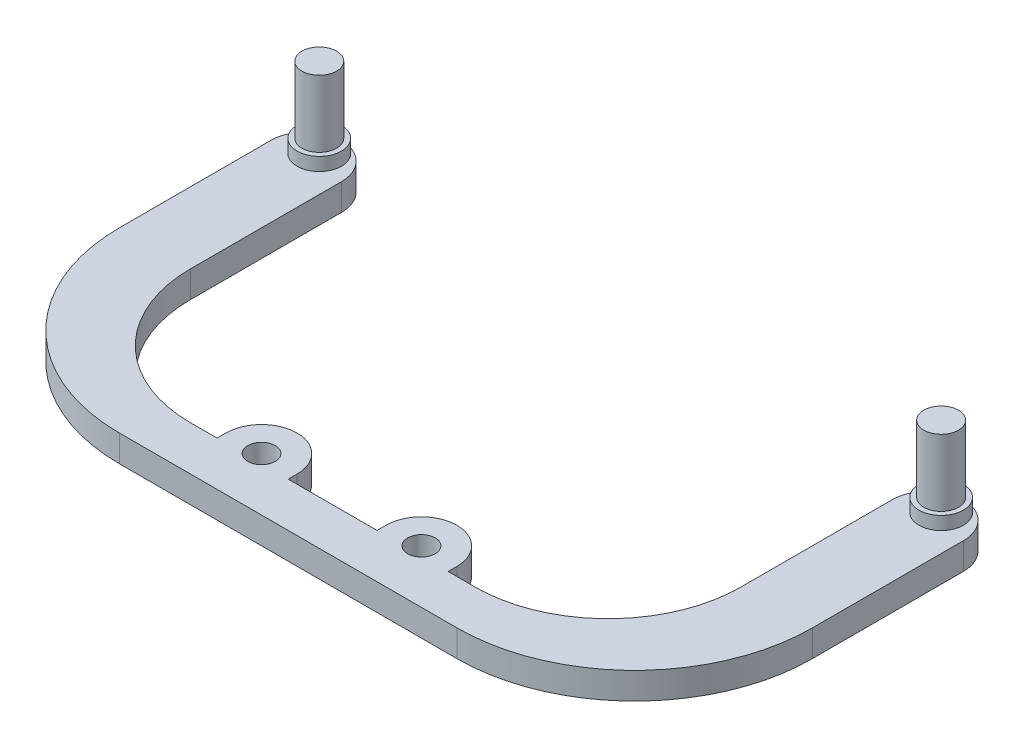
ISO-10303-21;
HEADER;
FILE_DESCRIPTION(('STEP AP214'),'2;1');
FILE_NAME('part.step','',(''),(''),'','','');
FILE_SCHEMA(('AUTOMOTIVE_DESIGN { 1 0 10303 214 1 1 1 1 }'));
ENDSEC;
DATA;
#1=APPLICATION_CONTEXT('core data for automotive mechanical design processes');
#2=APPLICATION_PROTOCOL_DEFINITION('international standard','automotive_design',2000,#1);
#3=PRODUCT_CONTEXT('',#1,'mechanical');
#4=PRODUCT('Part','Part','',(#3));
#5=PRODUCT_RELATED_PRODUCT_CATEGORY('part','',(#4));
#6=PRODUCT_DEFINITION_FORMATION('','',#4);
#7=PRODUCT_DEFINITION_CONTEXT('part definition',#1,'design');
#8=PRODUCT_DEFINITION('design','',#6,#7);
#9=PRODUCT_DEFINITION_SHAPE('','',#8);
#10=(LENGTH_UNIT() NAMED_UNIT(*) SI_UNIT(.MILLI.,.METRE.));
#11=(NAMED_UNIT(*) PLANE_ANGLE_UNIT() SI_UNIT($,.RADIAN.));
#12=(NAMED_UNIT(*) SI_UNIT($,.STERADIAN.) SOLID_ANGLE_UNIT());
#13=UNCERTAINTY_MEASURE_WITH_UNIT(LENGTH_MEASURE(1.E-05),#10,'distance_accuracy_value','');
#14=(GEOMETRIC_REPRESENTATION_CONTEXT(3) GLOBAL_UNCERTAINTY_ASSIGNED_CONTEXT((#13)) GLOBAL_UNIT_ASSIGNED_CONTEXT((#10,
#11,#12)) REPRESENTATION_CONTEXT('',''));
#15=CARTESIAN_POINT('',(0.,0.,0.));
#16=DIRECTION('',(0.,0.,1.));
#17=DIRECTION('',(1.,0.,0.));
#18=AXIS2_PLACEMENT_3D('',#15,#16,#17);
#19=CARTESIAN_POINT('',(0.,3.,0.));
#20=DIRECTION('',(0.,-1.,0.));
#21=DIRECTION('',(0.,0.,-1.));
#22=AXIS2_PLACEMENT_3D('',#19,#20,#21);
#23=PLANE('',#22);
#24=CARTESIAN_POINT('',(-9.,3.,-1.));
#25=DIRECTION('',(0.,1.,0.));
#26=DIRECTION('',(0.,0.,1.));
#27=AXIS2_PLACEMENT_3D('',#24,#25,#26);
#28=CIRCLE('',#27,1.55);
#29=CARTESIAN_POINT('',(-9.,3.,0.549999999999997));
#30=VERTEX_POINT('',#29);
#31=EDGE_CURVE('E228',#30,#30,#28,.T.);
#32=ORIENTED_EDGE('',*,*,#31,.F.);
#33=EDGE_LOOP('',(#32));
#34=FACE_BOUND('',#33,.T.);
#35=CARTESIAN_POINT('',(9.,3.,-1.));
#36=DIRECTION('',(0.,-1.,0.));
#37=DIRECTION('',(0.,0.,1.));
#38=AXIS2_PLACEMENT_3D('',#35,#36,#37);
#39=CIRCLE('',#38,1.55);
#40=CARTESIAN_POINT('',(9.,3.,0.549999999999995));
#41=VERTEX_POINT('',#40);
#42=EDGE_CURVE('E205',#41,#41,#39,.T.);
#43=ORIENTED_EDGE('',*,*,#42,.T.);
#44=EDGE_LOOP('',(#43));
#45=FACE_BOUND('',#44,.T.);
#46=CARTESIAN_POINT('',(35.,3.,-32.));
#47=DIRECTION('',(0.,1.,0.));
#48=DIRECTION('',(0.,0.,1.));
#49=AXIS2_PLACEMENT_3D('',#46,#47,#48);
#50=CIRCLE('',#49,4.);
#51=CARTESIAN_POINT('',(35.,3.,-36.));
#52=VERTEX_POINT('',#51);
#53=CARTESIAN_POINT('',(31.,3.,-32.));
#54=VERTEX_POINT('',#53);
#55=EDGE_CURVE('E525',#52,#54,#50,.T.);
#56=ORIENTED_EDGE('',*,*,#55,.T.);
#57=DIRECTION('',(0.,0.,-1.));
#58=VECTOR('',#57,1.);
#59=CARTESIAN_POINT('',(31.,3.,-37.));
#60=LINE('',#59,#58);
#61=CARTESIAN_POINT('',(31.,3.,-15.));
#62=VERTEX_POINT('',#61);
#63=EDGE_CURVE('E380',#62,#54,#60,.T.);
#64=ORIENTED_EDGE('',*,*,#63,.F.);
#65=CARTESIAN_POINT('',(16.,3.,-15.));
#66=DIRECTION('',(0.,-1.,0.));
#67=DIRECTION('',(0.,0.,-1.));
#68=AXIS2_PLACEMENT_3D('',#65,#66,#67);
#69=CIRCLE('',#68,15.);
#70=CARTESIAN_POINT('',(16.,3.,0.));
#71=VERTEX_POINT('',#70);
#72=EDGE_CURVE('E319',#62,#71,#69,.T.);
#73=ORIENTED_EDGE('',*,*,#72,.T.);
#74=DIRECTION('',(1.,0.,0.));
#75=VECTOR('',#74,1.);
#76=CARTESIAN_POINT('',(31.,3.,0.));
#77=LINE('',#76,#75);
#78=CARTESIAN_POINT('',(13.,3.,0.));
#79=VERTEX_POINT('',#78);
#80=EDGE_CURVE('E383',#79,#71,#77,.T.);
#81=ORIENTED_EDGE('',*,*,#80,.F.);
#82=DIRECTION('',(0.,0.,1.));
#83=VECTOR('',#82,1.);
#84=CARTESIAN_POINT('',(13.,3.,0.));
#85=LINE('',#84,#83);
#86=CARTESIAN_POINT('',(13.,3.,-1.00000000000001));
#87=VERTEX_POINT('',#86);
#88=EDGE_CURVE('E385',#87,#79,#85,.T.);
#89=ORIENTED_EDGE('',*,*,#88,.F.);
#90=CARTESIAN_POINT('',(9.,3.,-1.00000000000001));
#91=DIRECTION('',(0.,-1.,0.));
#92=DIRECTION('',(0.,0.,-1.));
#93=AXIS2_PLACEMENT_3D('',#90,#91,#92);
#94=CIRCLE('',#93,4.);
#95=CARTESIAN_POINT('',(5.,3.,-1.00000000000001));
#96=VERTEX_POINT('',#95);
#97=EDGE_CURVE('E294',#87,#96,#94,.F.);
#98=ORIENTED_EDGE('',*,*,#97,.T.);
#99=DIRECTION('',(0.,0.,-1.));
#100=VECTOR('',#99,1.);
#101=CARTESIAN_POINT('',(5.,3.,-5.));
#102=LINE('',#101,#100);
#103=CARTESIAN_POINT('',(5.,3.,0.));
#104=VERTEX_POINT('',#103);
#105=EDGE_CURVE('E208',#104,#96,#102,.T.);
#106=ORIENTED_EDGE('',*,*,#105,.F.);
#107=DIRECTION('',(-1.,0.,0.));
#108=VECTOR('',#107,1.);
#109=CARTESIAN_POINT('',(-5.,3.,0.));
#110=LINE('',#109,#108);
#111=CARTESIAN_POINT('',(-5.,3.,0.));
#112=VERTEX_POINT('',#111);
#113=EDGE_CURVE('E241',#104,#112,#110,.T.);
#114=ORIENTED_EDGE('',*,*,#113,.T.);
#115=DIRECTION('',(0.,0.,-1.));
#116=VECTOR('',#115,1.);
#117=CARTESIAN_POINT('',(-5.,3.,-5.));
#118=LINE('',#117,#116);
#119=CARTESIAN_POINT('',(-5.,3.,-1.));
#120=VERTEX_POINT('',#119);
#121=EDGE_CURVE('E243',#112,#120,#118,.T.);
#122=ORIENTED_EDGE('',*,*,#121,.T.);
#123=CARTESIAN_POINT('',(-9.,3.,-1.));
#124=DIRECTION('',(0.,-1.,0.));
#125=DIRECTION('',(0.,0.,-1.));
#126=AXIS2_PLACEMENT_3D('',#123,#124,#125);
#127=CIRCLE('',#126,4.);
#128=CARTESIAN_POINT('',(-13.,3.,-1.));
#129=VERTEX_POINT('',#128);
#130=EDGE_CURVE('E282',#120,#129,#127,.F.);
#131=ORIENTED_EDGE('',*,*,#130,.T.);
#132=DIRECTION('',(0.,0.,1.));
#133=VECTOR('',#132,1.);
#134=CARTESIAN_POINT('',(-13.,3.,0.));
#135=LINE('',#134,#133);
#136=CARTESIAN_POINT('',(-13.,3.,0.));
#137=VERTEX_POINT('',#136);
#138=EDGE_CURVE('E246',#129,#137,#135,.T.);
#139=ORIENTED_EDGE('',*,*,#138,.T.);
#140=DIRECTION('',(-1.,0.,0.));
#141=VECTOR('',#140,1.);
#142=CARTESIAN_POINT('',(-31.,3.,0.));
#143=LINE('',#142,#141);
#144=CARTESIAN_POINT('',(-16.,3.,0.));
#145=VERTEX_POINT('',#144);
#146=EDGE_CURVE('E248',#137,#145,#143,.T.);
#147=ORIENTED_EDGE('',*,*,#146,.T.);
#148=CARTESIAN_POINT('',(-16.,3.,-15.));
#149=DIRECTION('',(0.,-1.,0.));
#150=DIRECTION('',(0.,0.,-1.));
#151=AXIS2_PLACEMENT_3D('',#148,#149,#150);
#152=CIRCLE('',#151,15.);
#153=CARTESIAN_POINT('',(-31.,3.,-15.));
#154=VERTEX_POINT('',#153);
#155=EDGE_CURVE('E323',#145,#154,#152,.T.);
#156=ORIENTED_EDGE('',*,*,#155,.T.);
#157=DIRECTION('',(0.,0.,-1.));
#158=VECTOR('',#157,1.);
#159=CARTESIAN_POINT('',(-31.,3.,-37.));
#160=LINE('',#159,#158);
#161=CARTESIAN_POINT('',(-31.,3.,-32.));
#162=VERTEX_POINT('',#161);
#163=EDGE_CURVE('E251',#154,#162,#160,.T.);
#164=ORIENTED_EDGE('',*,*,#163,.T.);
#165=CARTESIAN_POINT('',(-35.,3.,-32.));
#166=DIRECTION('',(0.,-1.,0.));
#167=DIRECTION('',(0.,0.,1.));
#168=AXIS2_PLACEMENT_3D('',#165,#166,#167);
#169=CIRCLE('',#168,4.);
#170=CARTESIAN_POINT('',(-35.,3.,-36.));
#171=VERTEX_POINT('',#170);
#172=EDGE_CURVE('E431',#171,#162,#169,.T.);
#173=ORIENTED_EDGE('',*,*,#172,.F.);
#174=CARTESIAN_POINT('',(-35.,3.,-33.5));
#175=DIRECTION('',(0.,-1.,0.));
#176=DIRECTION('',(0.,0.,-1.));
#177=AXIS2_PLACEMENT_3D('',#174,#175,#176);
#178=CIRCLE('',#177,2.5);
#179=EDGE_CURVE('E296',#171,#171,#178,.F.);
#180=ORIENTED_EDGE('',*,*,#179,.F.);
#181=CARTESIAN_POINT('',(-39.,3.,-32.));
#182=VERTEX_POINT('',#181);
#183=EDGE_CURVE('E368',#182,#171,#169,.T.);
#184=ORIENTED_EDGE('',*,*,#183,.F.);
#185=DIRECTION('',(0.,0.,1.));
#186=VECTOR('',#185,1.);
#187=CARTESIAN_POINT('',(-39.,3.,5.));
#188=LINE('',#187,#186);
#189=CARTESIAN_POINT('',(-39.,3.,-15.));
#190=VERTEX_POINT('',#189);
#191=EDGE_CURVE('E235',#182,#190,#188,.T.);
#192=ORIENTED_EDGE('',*,*,#191,.T.);
#193=CARTESIAN_POINT('',(-19.,3.,-15.));
#194=DIRECTION('',(0.,-1.,0.));
#195=DIRECTION('',(0.,0.,-1.));
#196=AXIS2_PLACEMENT_3D('',#193,#194,#195);
#197=CIRCLE('',#196,20.);
#198=CARTESIAN_POINT('',(-19.,3.,5.));
#199=VERTEX_POINT('',#198);
#200=EDGE_CURVE('E336',#190,#199,#197,.F.);
#201=ORIENTED_EDGE('',*,*,#200,.T.);
#202=DIRECTION('',(1.,0.,0.));
#203=VECTOR('',#202,1.);
#204=CARTESIAN_POINT('',(0.,3.,5.));
#205=LINE('',#204,#203);
#206=CARTESIAN_POINT('',(19.,3.,5.));
#207=VERTEX_POINT('',#206);
#208=EDGE_CURVE('E237',#199,#207,#205,.T.);
#209=ORIENTED_EDGE('',*,*,#208,.T.);
#210=CARTESIAN_POINT('',(19.,3.,-15.));
#211=DIRECTION('',(0.,-1.,0.));
#212=DIRECTION('',(0.,0.,-1.));
#213=AXIS2_PLACEMENT_3D('',#210,#211,#212);
#214=CIRCLE('',#213,20.);
#215=CARTESIAN_POINT('',(39.,3.,-15.));
#216=VERTEX_POINT('',#215);
#217=EDGE_CURVE('E46',#207,#216,#214,.F.);
#218=ORIENTED_EDGE('',*,*,#217,.T.);
#219=DIRECTION('',(0.,0.,1.));
#220=VECTOR('',#219,1.);
#221=CARTESIAN_POINT('',(39.,3.,4.99999999999999));
#222=LINE('',#221,#220);
#223=CARTESIAN_POINT('',(39.,3.,-32.));
#224=VERTEX_POINT('',#223);
#225=EDGE_CURVE('E218',#224,#216,#222,.T.);
#226=ORIENTED_EDGE('',*,*,#225,.F.);
#227=EDGE_CURVE('E182',#224,#52,#50,.T.);
#228=ORIENTED_EDGE('',*,*,#227,.T.);
#229=CARTESIAN_POINT('',(35.,3.,-33.5));
#230=DIRECTION('',(0.,-1.,0.));
#231=DIRECTION('',(0.,0.,1.));
#232=AXIS2_PLACEMENT_3D('',#229,#230,#231);
#233=CIRCLE('',#232,2.5);
#234=EDGE_CURVE('E361',#52,#52,#233,.T.);
#235=ORIENTED_EDGE('',*,*,#234,.T.);
#236=EDGE_LOOP('',(#56,#64,#73,#81,#89,#98,#106,#114,#122,#131,#139,#147,#156,#164,#173,#180,
#184,#192,#201,#209,#218,#226,#228,#235));
#237=FACE_BOUND('',#236,.T.);
#238=ADVANCED_FACE('F38',(#34,#45,#237),#23,.F.);
#239=CARTESIAN_POINT('',(0.,0.,0.));
#240=DIRECTION('',(0.,-1.,0.));
#241=DIRECTION('',(0.,0.,-1.));
#242=AXIS2_PLACEMENT_3D('',#239,#240,#241);
#243=PLANE('',#242);
#244=CARTESIAN_POINT('',(9.,0.,-1.));
#245=DIRECTION('',(0.,-1.,0.));
#246=DIRECTION('',(0.,0.,1.));
#247=AXIS2_PLACEMENT_3D('',#244,#245,#246);
#248=CIRCLE('',#247,1.55);
#249=CARTESIAN_POINT('',(9.,0.,0.549999999999995));
#250=VERTEX_POINT('',#249);
#251=EDGE_CURVE('E200',#250,#250,#248,.T.);
#252=ORIENTED_EDGE('',*,*,#251,.F.);
#253=EDGE_LOOP('',(#252));
#254=FACE_BOUND('',#253,.T.);
#255=CARTESIAN_POINT('',(-9.,0.,-1.));
#256=DIRECTION('',(0.,1.,0.));
#257=DIRECTION('',(0.,0.,1.));
#258=AXIS2_PLACEMENT_3D('',#255,#256,#257);
#259=CIRCLE('',#258,1.55);
#260=CARTESIAN_POINT('',(-9.,0.,0.549999999999997));
#261=VERTEX_POINT('',#260);
#262=EDGE_CURVE('E229',#261,#261,#259,.T.);
#263=ORIENTED_EDGE('',*,*,#262,.T.);
#264=EDGE_LOOP('',(#263));
#265=FACE_BOUND('',#264,.T.);
#266=DIRECTION('',(0.,0.,-1.));
#267=VECTOR('',#266,1.);
#268=CARTESIAN_POINT('',(31.,0.,-37.));
#269=LINE('',#268,#267);
#270=CARTESIAN_POINT('',(31.,0.,-15.));
#271=VERTEX_POINT('',#270);
#272=CARTESIAN_POINT('',(31.,0.,-32.));
#273=VERTEX_POINT('',#272);
#274=EDGE_CURVE('E194',#271,#273,#269,.T.);
#275=ORIENTED_EDGE('',*,*,#274,.T.);
#276=CARTESIAN_POINT('',(35.,0.,-32.));
#277=DIRECTION('',(0.,1.,0.));
#278=DIRECTION('',(0.,0.,1.));
#279=AXIS2_PLACEMENT_3D('',#276,#277,#278);
#280=CIRCLE('',#279,4.);
#281=CARTESIAN_POINT('',(39.,0.,-32.));
#282=VERTEX_POINT('',#281);
#283=EDGE_CURVE('E53',#282,#273,#280,.T.);
#284=ORIENTED_EDGE('',*,*,#283,.F.);
#285=DIRECTION('',(0.,0.,1.));
#286=VECTOR('',#285,1.);
#287=CARTESIAN_POINT('',(39.,0.,4.99999999999999));
#288=LINE('',#287,#286);
#289=CARTESIAN_POINT('',(39.,0.,-15.));
#290=VERTEX_POINT('',#289);
#291=EDGE_CURVE('E191',#282,#290,#288,.T.);
#292=ORIENTED_EDGE('',*,*,#291,.T.);
#293=CARTESIAN_POINT('',(19.,0.,-15.));
#294=DIRECTION('',(0.,-1.,0.));
#295=DIRECTION('',(0.,0.,-1.));
#296=AXIS2_PLACEMENT_3D('',#293,#294,#295);
#297=CIRCLE('',#296,20.);
#298=CARTESIAN_POINT('',(19.,0.,5.));
#299=VERTEX_POINT('',#298);
#300=EDGE_CURVE('E329',#290,#299,#297,.T.);
#301=ORIENTED_EDGE('',*,*,#300,.T.);
#302=DIRECTION('',(1.,0.,0.));
#303=VECTOR('',#302,1.);
#304=CARTESIAN_POINT('',(0.,0.,5.));
#305=LINE('',#304,#303);
#306=CARTESIAN_POINT('',(-19.,0.,5.));
#307=VERTEX_POINT('',#306);
#308=EDGE_CURVE('E256',#307,#299,#305,.T.);
#309=ORIENTED_EDGE('',*,*,#308,.F.);
#310=CARTESIAN_POINT('',(-19.,0.,-15.));
#311=DIRECTION('',(0.,-1.,0.));
#312=DIRECTION('',(0.,0.,-1.));
#313=AXIS2_PLACEMENT_3D('',#310,#311,#312);
#314=CIRCLE('',#313,20.);
#315=CARTESIAN_POINT('',(-39.,0.,-15.));
#316=VERTEX_POINT('',#315);
#317=EDGE_CURVE('E326',#307,#316,#314,.T.);
#318=ORIENTED_EDGE('',*,*,#317,.T.);
#319=DIRECTION('',(0.,0.,1.));
#320=VECTOR('',#319,1.);
#321=CARTESIAN_POINT('',(-39.,0.,5.));
#322=LINE('',#321,#320);
#323=CARTESIAN_POINT('',(-39.,0.,-32.));
#324=VERTEX_POINT('',#323);
#325=EDGE_CURVE('E232',#324,#316,#322,.T.);
#326=ORIENTED_EDGE('',*,*,#325,.F.);
#327=CARTESIAN_POINT('',(-35.,0.,-32.));
#328=DIRECTION('',(0.,-1.,0.));
#329=DIRECTION('',(0.,0.,1.));
#330=AXIS2_PLACEMENT_3D('',#327,#328,#329);
#331=CIRCLE('',#330,4.);
#332=CARTESIAN_POINT('',(-31.,0.,-32.));
#333=VERTEX_POINT('',#332);
#334=EDGE_CURVE('E354',#324,#333,#331,.T.);
#335=ORIENTED_EDGE('',*,*,#334,.T.);
#336=DIRECTION('',(0.,0.,-1.));
#337=VECTOR('',#336,1.);
#338=CARTESIAN_POINT('',(-31.,0.,-37.));
#339=LINE('',#338,#337);
#340=CARTESIAN_POINT('',(-31.,0.,-15.));
#341=VERTEX_POINT('',#340);
#342=EDGE_CURVE('E238',#341,#333,#339,.T.);
#343=ORIENTED_EDGE('',*,*,#342,.F.);
#344=CARTESIAN_POINT('',(-16.,0.,-15.));
#345=DIRECTION('',(0.,-1.,0.));
#346=DIRECTION('',(0.,0.,-1.));
#347=AXIS2_PLACEMENT_3D('',#344,#345,#346);
#348=CIRCLE('',#347,15.);
#349=CARTESIAN_POINT('',(-16.,0.,0.));
#350=VERTEX_POINT('',#349);
#351=EDGE_CURVE('E321',#341,#350,#348,.F.);
#352=ORIENTED_EDGE('',*,*,#351,.T.);
#353=DIRECTION('',(-1.,0.,0.));
#354=VECTOR('',#353,1.);
#355=CARTESIAN_POINT('',(-31.,0.,0.));
#356=LINE('',#355,#354);
#357=CARTESIAN_POINT('',(-13.,0.,0.));
#358=VERTEX_POINT('',#357);
#359=EDGE_CURVE('E266',#358,#350,#356,.T.);
#360=ORIENTED_EDGE('',*,*,#359,.F.);
#361=DIRECTION('',(0.,0.,1.));
#362=VECTOR('',#361,1.);
#363=CARTESIAN_POINT('',(-13.,0.,0.));
#364=LINE('',#363,#362);
#365=CARTESIAN_POINT('',(-13.,0.,-1.));
#366=VERTEX_POINT('',#365);
#367=EDGE_CURVE('E264',#366,#358,#364,.T.);
#368=ORIENTED_EDGE('',*,*,#367,.F.);
#369=CARTESIAN_POINT('',(-9.,0.,-1.));
#370=DIRECTION('',(0.,-1.,0.));
#371=DIRECTION('',(0.,0.,-1.));
#372=AXIS2_PLACEMENT_3D('',#369,#370,#371);
#373=CIRCLE('',#372,4.);
#374=CARTESIAN_POINT('',(-5.,0.,-1.));
#375=VERTEX_POINT('',#374);
#376=EDGE_CURVE('E284',#366,#375,#373,.T.);
#377=ORIENTED_EDGE('',*,*,#376,.T.);
#378=DIRECTION('',(0.,0.,-1.));
#379=VECTOR('',#378,1.);
#380=CARTESIAN_POINT('',(-5.,0.,-5.));
#381=LINE('',#380,#379);
#382=CARTESIAN_POINT('',(-5.,0.,0.));
#383=VERTEX_POINT('',#382);
#384=EDGE_CURVE('E261',#383,#375,#381,.T.);
#385=ORIENTED_EDGE('',*,*,#384,.F.);
#386=DIRECTION('',(-1.,0.,0.));
#387=VECTOR('',#386,1.);
#388=CARTESIAN_POINT('',(-5.,0.,0.));
#389=LINE('',#388,#387);
#390=CARTESIAN_POINT('',(5.,0.,0.));
#391=VERTEX_POINT('',#390);
#392=EDGE_CURVE('E259',#391,#383,#389,.T.);
#393=ORIENTED_EDGE('',*,*,#392,.F.);
#394=DIRECTION('',(0.,0.,-1.));
#395=VECTOR('',#394,1.);
#396=CARTESIAN_POINT('',(5.,0.,-5.));
#397=LINE('',#396,#395);
#398=CARTESIAN_POINT('',(5.,0.,-1.00000000000001));
#399=VERTEX_POINT('',#398);
#400=EDGE_CURVE('E215',#391,#399,#397,.T.);
#401=ORIENTED_EDGE('',*,*,#400,.T.);
#402=CARTESIAN_POINT('',(9.,0.,-1.00000000000001));
#403=DIRECTION('',(0.,-1.,0.));
#404=DIRECTION('',(0.,0.,-1.));
#405=AXIS2_PLACEMENT_3D('',#402,#403,#404);
#406=CIRCLE('',#405,4.);
#407=CARTESIAN_POINT('',(13.,0.,-1.00000000000001));
#408=VERTEX_POINT('',#407);
#409=EDGE_CURVE('E292',#399,#408,#406,.T.);
#410=ORIENTED_EDGE('',*,*,#409,.T.);
#411=DIRECTION('',(0.,0.,1.));
#412=VECTOR('',#411,1.);
#413=CARTESIAN_POINT('',(13.,0.,0.));
#414=LINE('',#413,#412);
#415=CARTESIAN_POINT('',(13.,0.,0.));
#416=VERTEX_POINT('',#415);
#417=EDGE_CURVE('E213',#408,#416,#414,.T.);
#418=ORIENTED_EDGE('',*,*,#417,.T.);
#419=DIRECTION('',(1.,0.,0.));
#420=VECTOR('',#419,1.);
#421=CARTESIAN_POINT('',(31.,0.,0.));
#422=LINE('',#421,#420);
#423=CARTESIAN_POINT('',(16.,0.,0.));
#424=VERTEX_POINT('',#423);
#425=EDGE_CURVE('E202',#416,#424,#422,.T.);
#426=ORIENTED_EDGE('',*,*,#425,.T.);
#427=CARTESIAN_POINT('',(16.,0.,-15.));
#428=DIRECTION('',(0.,-1.,0.));
#429=DIRECTION('',(0.,0.,-1.));
#430=AXIS2_PLACEMENT_3D('',#427,#428,#429);
#431=CIRCLE('',#430,15.);
#432=EDGE_CURVE('E317',#424,#271,#431,.F.);
#433=ORIENTED_EDGE('',*,*,#432,.T.);
#434=EDGE_LOOP('',(#275,#284,#292,#301,#309,#318,#326,#335,#343,#352,#360,#368,#377,#385,#393,
#401,#410,#418,#426,#433));
#435=FACE_BOUND('',#434,.T.);
#436=ADVANCED_FACE('F190',(#254,#265,#435),#243,.T.);
#437=CARTESIAN_POINT('',(39.,3.,4.99999999999999));
#438=DIRECTION('',(1.,0.,0.));
#439=DIRECTION('',(0.,0.,-1.));
#440=AXIS2_PLACEMENT_3D('',#437,#438,#439);
#441=PLANE('',#440);
#442=ORIENTED_EDGE('',*,*,#291,.F.);
#443=DIRECTION('',(0.,1.,0.));
#444=VECTOR('',#443,1.);
#445=CARTESIAN_POINT('',(39.,0.,-32.));
#446=LINE('',#445,#444);
#447=EDGE_CURVE('E179',#282,#224,#446,.T.);
#448=ORIENTED_EDGE('',*,*,#447,.T.);
#449=ORIENTED_EDGE('',*,*,#225,.T.);
#450=DIRECTION('',(0.,-1.,0.));
#451=VECTOR('',#450,1.);
#452=CARTESIAN_POINT('',(39.,0.,-15.));
#453=LINE('',#452,#451);
#454=EDGE_CURVE('E199',#216,#290,#453,.T.);
#455=ORIENTED_EDGE('',*,*,#454,.T.);
#456=EDGE_LOOP('',(#442,#448,#449,#455));
#457=FACE_BOUND('',#456,.T.);
#458=ADVANCED_FACE('F197',(#457),#441,.T.);
#459=CARTESIAN_POINT('',(-31.,3.,-37.));
#460=DIRECTION('',(-1.,0.,0.));
#461=DIRECTION('',(0.,0.,1.));
#462=AXIS2_PLACEMENT_3D('',#459,#460,#461);
#463=PLANE('',#462);
#464=DIRECTION('',(0.,1.,0.));
#465=VECTOR('',#464,1.);
#466=CARTESIAN_POINT('',(-31.,0.,-32.));
#467=LINE('',#466,#465);
#468=EDGE_CURVE('E61',#333,#162,#467,.T.);
#469=ORIENTED_EDGE('',*,*,#468,.T.);
#470=ORIENTED_EDGE('',*,*,#163,.F.);
#471=DIRECTION('',(0.,-1.,0.));
#472=VECTOR('',#471,1.);
#473=CARTESIAN_POINT('',(-31.,0.,-15.));
#474=LINE('',#473,#472);
#475=EDGE_CURVE('E312',#154,#341,#474,.T.);
#476=ORIENTED_EDGE('',*,*,#475,.T.);
#477=ORIENTED_EDGE('',*,*,#342,.T.);
#478=EDGE_LOOP('',(#469,#470,#476,#477));
#479=FACE_BOUND('',#478,.T.);
#480=ADVANCED_FACE('F428',(#479),#463,.F.);
#481=CARTESIAN_POINT('',(9.,0.,-1.00000000000001));
#482=DIRECTION('',(0.,-1.,0.));
#483=DIRECTION('',(0.,0.,-1.));
#484=AXIS2_PLACEMENT_3D('',#481,#482,#483);
#485=CYLINDRICAL_SURFACE('',#484,4.);
#486=DIRECTION('',(0.,-1.,0.));
#487=VECTOR('',#486,1.);
#488=CARTESIAN_POINT('',(13.,3.,-1.00000000000001));
#489=LINE('',#488,#487);
#490=EDGE_CURVE('E286',#408,#87,#489,.F.);
#491=ORIENTED_EDGE('',*,*,#490,.F.);
#492=ORIENTED_EDGE('',*,*,#409,.F.);
#493=DIRECTION('',(0.,-1.,0.));
#494=VECTOR('',#493,1.);
#495=CARTESIAN_POINT('',(5.,3.,-1.00000000000001));
#496=LINE('',#495,#494);
#497=EDGE_CURVE('E289',#96,#399,#496,.T.);
#498=ORIENTED_EDGE('',*,*,#497,.F.);
#499=ORIENTED_EDGE('',*,*,#97,.F.);
#500=EDGE_LOOP('',(#491,#492,#498,#499));
#501=FACE_BOUND('',#500,.T.);
#502=ADVANCED_FACE('F400',(#501),#485,.T.);
#503=CARTESIAN_POINT('',(-9.,3.,-1.));
#504=DIRECTION('',(0.,-1.,0.));
#505=DIRECTION('',(0.,0.,-1.));
#506=AXIS2_PLACEMENT_3D('',#503,#504,#505);
#507=CYLINDRICAL_SURFACE('',#506,4.);
#508=DIRECTION('',(0.,-1.,0.));
#509=VECTOR('',#508,1.);
#510=CARTESIAN_POINT('',(-13.,3.,-1.));
#511=LINE('',#510,#509);
#512=EDGE_CURVE('E276',#129,#366,#511,.T.);
#513=ORIENTED_EDGE('',*,*,#512,.F.);
#514=ORIENTED_EDGE('',*,*,#130,.F.);
#515=DIRECTION('',(0.,-1.,0.));
#516=VECTOR('',#515,1.);
#517=CARTESIAN_POINT('',(-5.,3.,-1.00000000000001));
#518=LINE('',#517,#516);
#519=EDGE_CURVE('E279',#375,#120,#518,.F.);
#520=ORIENTED_EDGE('',*,*,#519,.F.);
#521=ORIENTED_EDGE('',*,*,#376,.F.);
#522=EDGE_LOOP('',(#513,#514,#520,#521));
#523=FACE_BOUND('',#522,.T.);
#524=ADVANCED_FACE('F413',(#523),#507,.T.);
#525=CARTESIAN_POINT('',(-39.,3.,5.));
#526=DIRECTION('',(1.,0.,0.));
#527=DIRECTION('',(0.,0.,-1.));
#528=AXIS2_PLACEMENT_3D('',#525,#526,#527);
#529=PLANE('',#528);
#530=ORIENTED_EDGE('',*,*,#191,.F.);
#531=DIRECTION('',(0.,1.,0.));
#532=VECTOR('',#531,1.);
#533=CARTESIAN_POINT('',(-39.,0.,-32.));
#534=LINE('',#533,#532);
#535=EDGE_CURVE('E359',#324,#182,#534,.T.);
#536=ORIENTED_EDGE('',*,*,#535,.F.);
#537=ORIENTED_EDGE('',*,*,#325,.T.);
#538=DIRECTION('',(0.,-1.,0.));
#539=VECTOR('',#538,1.);
#540=CARTESIAN_POINT('',(-39.,3.,-15.));
#541=LINE('',#540,#539);
#542=EDGE_CURVE('E11',#316,#190,#541,.F.);
#543=ORIENTED_EDGE('',*,*,#542,.T.);
#544=EDGE_LOOP('',(#530,#536,#537,#543));
#545=FACE_BOUND('',#544,.T.);
#546=ADVANCED_FACE('F358',(#545),#529,.F.);
#547=CARTESIAN_POINT('',(0.,3.,5.));
#548=DIRECTION('',(0.,0.,-1.));
#549=DIRECTION('',(-1.,0.,0.));
#550=AXIS2_PLACEMENT_3D('',#547,#548,#549);
#551=PLANE('',#550);
#552=ORIENTED_EDGE('',*,*,#308,.T.);
#553=DIRECTION('',(0.,-1.,0.));
#554=VECTOR('',#553,1.);
#555=CARTESIAN_POINT('',(19.,3.,5.));
#556=LINE('',#555,#554);
#557=EDGE_CURVE('E334',#299,#207,#556,.F.);
#558=ORIENTED_EDGE('',*,*,#557,.T.);
#559=ORIENTED_EDGE('',*,*,#208,.F.);
#560=DIRECTION('',(0.,-1.,0.));
#561=VECTOR('',#560,1.);
#562=CARTESIAN_POINT('',(-19.,3.,5.));
#563=LINE('',#562,#561);
#564=EDGE_CURVE('E331',#199,#307,#563,.T.);
#565=ORIENTED_EDGE('',*,*,#564,.T.);
#566=EDGE_LOOP('',(#552,#558,#559,#565));
#567=FACE_BOUND('',#566,.T.);
#568=ADVANCED_FACE('F347',(#567),#551,.F.);
#569=CARTESIAN_POINT('',(-5.,3.,0.));
#570=DIRECTION('',(0.,0.,1.));
#571=DIRECTION('',(1.,0.,0.));
#572=AXIS2_PLACEMENT_3D('',#569,#570,#571);
#573=PLANE('',#572);
#574=ORIENTED_EDGE('',*,*,#392,.T.);
#575=DIRECTION('',(0.,-1.,0.));
#576=VECTOR('',#575,1.);
#577=CARTESIAN_POINT('',(-5.,3.,0.));
#578=LINE('',#577,#576);
#579=EDGE_CURVE('E273',#112,#383,#578,.T.);
#580=ORIENTED_EDGE('',*,*,#579,.F.);
#581=ORIENTED_EDGE('',*,*,#113,.F.);
#582=DIRECTION('',(0.,-1.,0.));
#583=VECTOR('',#582,1.);
#584=CARTESIAN_POINT('',(5.,3.,0.));
#585=LINE('',#584,#583);
#586=EDGE_CURVE('E219',#104,#391,#585,.T.);
#587=ORIENTED_EDGE('',*,*,#586,.T.);
#588=EDGE_LOOP('',(#574,#580,#581,#587));
#589=FACE_BOUND('',#588,.T.);
#590=ADVANCED_FACE('F404',(#589),#573,.F.);
#591=CARTESIAN_POINT('',(-5.,3.,-5.));
#592=DIRECTION('',(-1.,0.,0.));
#593=DIRECTION('',(0.,0.,1.));
#594=AXIS2_PLACEMENT_3D('',#591,#592,#593);
#595=PLANE('',#594);
#596=ORIENTED_EDGE('',*,*,#384,.T.);
#597=ORIENTED_EDGE('',*,*,#519,.T.);
#598=ORIENTED_EDGE('',*,*,#121,.F.);
#599=ORIENTED_EDGE('',*,*,#579,.T.);
#600=EDGE_LOOP('',(#596,#597,#598,#599));
#601=FACE_BOUND('',#600,.T.);
#602=ADVANCED_FACE('F407',(#601),#595,.F.);
#603=CARTESIAN_POINT('',(-13.,3.,0.));
#604=DIRECTION('',(1.,0.,0.));
#605=DIRECTION('',(0.,0.,-1.));
#606=AXIS2_PLACEMENT_3D('',#603,#604,#605);
#607=PLANE('',#606);
#608=ORIENTED_EDGE('',*,*,#138,.F.);
#609=ORIENTED_EDGE('',*,*,#512,.T.);
#610=ORIENTED_EDGE('',*,*,#367,.T.);
#611=DIRECTION('',(0.,-1.,0.));
#612=VECTOR('',#611,1.);
#613=CARTESIAN_POINT('',(-13.,3.,0.));
#614=LINE('',#613,#612);
#615=EDGE_CURVE('E254',#137,#358,#614,.T.);
#616=ORIENTED_EDGE('',*,*,#615,.F.);
#617=EDGE_LOOP('',(#608,#609,#610,#616));
#618=FACE_BOUND('',#617,.T.);
#619=ADVANCED_FACE('F416',(#618),#607,.F.);
#620=CARTESIAN_POINT('',(-31.,3.,0.));
#621=DIRECTION('',(0.,0.,1.));
#622=DIRECTION('',(1.,0.,0.));
#623=AXIS2_PLACEMENT_3D('',#620,#621,#622);
#624=PLANE('',#623);
#625=ORIENTED_EDGE('',*,*,#359,.T.);
#626=DIRECTION('',(0.,-1.,0.));
#627=VECTOR('',#626,1.);
#628=CARTESIAN_POINT('',(-16.,3.,0.));
#629=LINE('',#628,#627);
#630=EDGE_CURVE('E315',#350,#145,#629,.F.);
#631=ORIENTED_EDGE('',*,*,#630,.T.);
#632=ORIENTED_EDGE('',*,*,#146,.F.);
#633=ORIENTED_EDGE('',*,*,#615,.T.);
#634=EDGE_LOOP('',(#625,#631,#632,#633));
#635=FACE_BOUND('',#634,.T.);
#636=ADVANCED_FACE('F420',(#635),#624,.F.);
#637=CARTESIAN_POINT('',(-9.,0.,-1.));
#638=DIRECTION('',(0.,1.,0.));
#639=DIRECTION('',(0.,0.,1.));
#640=AXIS2_PLACEMENT_3D('',#637,#638,#639);
#641=CYLINDRICAL_SURFACE('',#640,1.55);
#642=ORIENTED_EDGE('',*,*,#262,.F.);
#643=EDGE_LOOP('',(#642));
#644=FACE_BOUND('',#643,.T.);
#645=ORIENTED_EDGE('',*,*,#31,.T.);
#646=EDGE_LOOP('',(#645));
#647=FACE_BOUND('',#646,.T.);
#648=ADVANCED_FACE('F461',(#644,#647),#641,.F.);
#649=CARTESIAN_POINT('',(31.,3.,-37.));
#650=DIRECTION('',(-1.,0.,0.));
#651=DIRECTION('',(0.,0.,1.));
#652=AXIS2_PLACEMENT_3D('',#649,#650,#651);
#653=PLANE('',#652);
#654=DIRECTION('',(0.,1.,0.));
#655=VECTOR('',#654,1.);
#656=CARTESIAN_POINT('',(31.,0.,-32.));
#657=LINE('',#656,#655);
#658=EDGE_CURVE('E186',#273,#54,#657,.T.);
#659=ORIENTED_EDGE('',*,*,#658,.F.);
#660=ORIENTED_EDGE('',*,*,#274,.F.);
#661=DIRECTION('',(0.,-1.,0.));
#662=VECTOR('',#661,1.);
#663=CARTESIAN_POINT('',(31.,3.,-15.));
#664=LINE('',#663,#662);
#665=EDGE_CURVE('E310',#271,#62,#664,.F.);
#666=ORIENTED_EDGE('',*,*,#665,.T.);
#667=ORIENTED_EDGE('',*,*,#63,.T.);
#668=EDGE_LOOP('',(#659,#660,#666,#667));
#669=FACE_BOUND('',#668,.T.);
#670=ADVANCED_FACE('F529',(#669),#653,.T.);
#671=CARTESIAN_POINT('',(31.,3.,0.));
#672=DIRECTION('',(0.,0.,-1.));
#673=DIRECTION('',(-1.,0.,0.));
#674=AXIS2_PLACEMENT_3D('',#671,#672,#673);
#675=PLANE('',#674);
#676=ORIENTED_EDGE('',*,*,#80,.T.);
#677=DIRECTION('',(0.,-1.,0.));
#678=VECTOR('',#677,1.);
#679=CARTESIAN_POINT('',(16.,0.,0.));
#680=LINE('',#679,#678);
#681=EDGE_CURVE('E307',#71,#424,#680,.T.);
#682=ORIENTED_EDGE('',*,*,#681,.T.);
#683=ORIENTED_EDGE('',*,*,#425,.F.);
#684=DIRECTION('',(0.,-1.,0.));
#685=VECTOR('',#684,1.);
#686=CARTESIAN_POINT('',(13.,3.,0.));
#687=LINE('',#686,#685);
#688=EDGE_CURVE('E222',#79,#416,#687,.T.);
#689=ORIENTED_EDGE('',*,*,#688,.F.);
#690=EDGE_LOOP('',(#676,#682,#683,#689));
#691=FACE_BOUND('',#690,.T.);
#692=ADVANCED_FACE('F535',(#691),#675,.T.);
#693=CARTESIAN_POINT('',(13.,3.,0.));
#694=DIRECTION('',(1.,0.,0.));
#695=DIRECTION('',(0.,0.,-1.));
#696=AXIS2_PLACEMENT_3D('',#693,#694,#695);
#697=PLANE('',#696);
#698=ORIENTED_EDGE('',*,*,#417,.F.);
#699=ORIENTED_EDGE('',*,*,#490,.T.);
#700=ORIENTED_EDGE('',*,*,#88,.T.);
#701=ORIENTED_EDGE('',*,*,#688,.T.);
#702=EDGE_LOOP('',(#698,#699,#700,#701));
#703=FACE_BOUND('',#702,.T.);
#704=ADVANCED_FACE('F536',(#703),#697,.T.);
#705=CARTESIAN_POINT('',(5.,3.,-5.));
#706=DIRECTION('',(-1.,0.,0.));
#707=DIRECTION('',(0.,0.,1.));
#708=AXIS2_PLACEMENT_3D('',#705,#706,#707);
#709=PLANE('',#708);
#710=ORIENTED_EDGE('',*,*,#105,.T.);
#711=ORIENTED_EDGE('',*,*,#497,.T.);
#712=ORIENTED_EDGE('',*,*,#400,.F.);
#713=ORIENTED_EDGE('',*,*,#586,.F.);
#714=EDGE_LOOP('',(#710,#711,#712,#713));
#715=FACE_BOUND('',#714,.T.);
#716=ADVANCED_FACE('F393',(#715),#709,.T.);
#717=CARTESIAN_POINT('',(9.,0.,-1.));
#718=DIRECTION('',(0.,1.,0.));
#719=DIRECTION('',(0.,0.,1.));
#720=AXIS2_PLACEMENT_3D('',#717,#718,#719);
#721=CYLINDRICAL_SURFACE('',#720,1.55);
#722=ORIENTED_EDGE('',*,*,#251,.T.);
#723=EDGE_LOOP('',(#722));
#724=FACE_BOUND('',#723,.T.);
#725=ORIENTED_EDGE('',*,*,#42,.F.);
#726=EDGE_LOOP('',(#725));
#727=FACE_BOUND('',#726,.T.);
#728=ADVANCED_FACE('F436',(#724,#727),#721,.F.);
#729=CARTESIAN_POINT('',(-35.,4.48,-33.5));
#730=DIRECTION('',(0.,-1.,0.));
#731=DIRECTION('',(0.,0.,-1.));
#732=AXIS2_PLACEMENT_3D('',#729,#730,#731);
#733=CYLINDRICAL_SURFACE('',#732,2.5);
#734=CARTESIAN_POINT('',(-35.,4.48,-33.5));
#735=DIRECTION('',(0.,1.,0.));
#736=DIRECTION('',(0.,0.,1.));
#737=AXIS2_PLACEMENT_3D('',#734,#735,#736);
#738=CIRCLE('',#737,2.5);
#739=CARTESIAN_POINT('',(-35.,4.48,-31.));
#740=VERTEX_POINT('',#739);
#741=EDGE_CURVE('E301',#740,#740,#738,.T.);
#742=ORIENTED_EDGE('',*,*,#741,.F.);
#743=EDGE_LOOP('',(#742));
#744=FACE_BOUND('',#743,.T.);
#745=ORIENTED_EDGE('',*,*,#179,.T.);
#746=EDGE_LOOP('',(#745));
#747=FACE_BOUND('',#746,.T.);
#748=ADVANCED_FACE('F433',(#744,#747),#733,.T.);
#749=CARTESIAN_POINT('',(-35.,4.48,-33.5));
#750=DIRECTION('',(0.,1.,0.));
#751=DIRECTION('',(0.,0.,1.));
#752=AXIS2_PLACEMENT_3D('',#749,#750,#751);
#753=PLANE('',#752);
#754=CARTESIAN_POINT('',(-35.,4.48,-33.5));
#755=DIRECTION('',(0.,1.,0.));
#756=DIRECTION('',(0.,0.,1.));
#757=AXIS2_PLACEMENT_3D('',#754,#755,#756);
#758=CIRCLE('',#757,1.95);
#759=CARTESIAN_POINT('',(-35.,4.48,-31.55));
#760=VERTEX_POINT('',#759);
#761=EDGE_CURVE('E297',#760,#760,#758,.T.);
#762=ORIENTED_EDGE('',*,*,#761,.F.);
#763=EDGE_LOOP('',(#762));
#764=FACE_BOUND('',#763,.T.);
#765=ORIENTED_EDGE('',*,*,#741,.T.);
#766=EDGE_LOOP('',(#765));
#767=FACE_BOUND('',#766,.T.);
#768=ADVANCED_FACE('F435',(#764,#767),#753,.T.);
#769=CARTESIAN_POINT('',(-35.,12.,-33.5));
#770=DIRECTION('',(0.,1.,0.));
#771=DIRECTION('',(0.,0.,1.));
#772=AXIS2_PLACEMENT_3D('',#769,#770,#771);
#773=PLANE('',#772);
#774=CARTESIAN_POINT('',(-35.,12.,-33.5));
#775=DIRECTION('',(0.,1.,0.));
#776=DIRECTION('',(0.,0.,1.));
#777=AXIS2_PLACEMENT_3D('',#774,#775,#776);
#778=CIRCLE('',#777,1.95);
#779=CARTESIAN_POINT('',(-35.,12.,-31.55));
#780=VERTEX_POINT('',#779);
#781=EDGE_CURVE('E225',#780,#780,#778,.T.);
#782=ORIENTED_EDGE('',*,*,#781,.T.);
#783=EDGE_LOOP('',(#782));
#784=FACE_BOUND('',#783,.T.);
#785=ADVANCED_FACE('F443',(#784),#773,.T.);
#786=CARTESIAN_POINT('',(-35.,12.,-33.5));
#787=DIRECTION('',(0.,-1.,0.));
#788=DIRECTION('',(0.,0.,-1.));
#789=AXIS2_PLACEMENT_3D('',#786,#787,#788);
#790=CYLINDRICAL_SURFACE('',#789,1.95);
#791=ORIENTED_EDGE('',*,*,#761,.T.);
#792=EDGE_LOOP('',(#791));
#793=FACE_BOUND('',#792,.T.);
#794=ORIENTED_EDGE('',*,*,#781,.F.);
#795=EDGE_LOOP('',(#794));
#796=FACE_BOUND('',#795,.T.);
#797=ADVANCED_FACE('F515',(#793,#796),#790,.T.);
#798=CARTESIAN_POINT('',(35.,4.48,-33.5));
#799=DIRECTION('',(0.,-1.,0.));
#800=DIRECTION('',(0.,0.,-1.));
#801=AXIS2_PLACEMENT_3D('',#798,#799,#800);
#802=CYLINDRICAL_SURFACE('',#801,2.5);
#803=CARTESIAN_POINT('',(35.,4.48,-33.5));
#804=DIRECTION('',(0.,-1.,0.));
#805=DIRECTION('',(0.,0.,1.));
#806=AXIS2_PLACEMENT_3D('',#803,#804,#805);
#807=CIRCLE('',#806,2.5);
#808=CARTESIAN_POINT('',(35.,4.48,-31.));
#809=VERTEX_POINT('',#808);
#810=EDGE_CURVE('E364',#809,#809,#807,.T.);
#811=ORIENTED_EDGE('',*,*,#810,.T.);
#812=EDGE_LOOP('',(#811));
#813=FACE_BOUND('',#812,.T.);
#814=ORIENTED_EDGE('',*,*,#234,.F.);
#815=EDGE_LOOP('',(#814));
#816=FACE_BOUND('',#815,.T.);
#817=ADVANCED_FACE('F512',(#813,#816),#802,.T.);
#818=CARTESIAN_POINT('',(35.,4.48,-33.5));
#819=DIRECTION('',(0.,1.,0.));
#820=DIRECTION('',(0.,0.,1.));
#821=AXIS2_PLACEMENT_3D('',#818,#819,#820);
#822=PLANE('',#821);
#823=CARTESIAN_POINT('',(35.,4.48,-33.5));
#824=DIRECTION('',(0.,1.,0.));
#825=DIRECTION('',(0.,0.,1.));
#826=AXIS2_PLACEMENT_3D('',#823,#824,#825);
#827=CIRCLE('',#826,1.95);
#828=CARTESIAN_POINT('',(35.,4.48,-31.55));
#829=VERTEX_POINT('',#828);
#830=EDGE_CURVE('E304',#829,#829,#827,.F.);
#831=ORIENTED_EDGE('',*,*,#830,.T.);
#832=EDGE_LOOP('',(#831));
#833=FACE_BOUND('',#832,.T.);
#834=ORIENTED_EDGE('',*,*,#810,.F.);
#835=EDGE_LOOP('',(#834));
#836=FACE_BOUND('',#835,.T.);
#837=ADVANCED_FACE('F508',(#833,#836),#822,.T.);
#838=CARTESIAN_POINT('',(35.,12.,-33.5));
#839=DIRECTION('',(0.,1.,0.));
#840=DIRECTION('',(0.,0.,1.));
#841=AXIS2_PLACEMENT_3D('',#838,#839,#840);
#842=PLANE('',#841);
#843=CARTESIAN_POINT('',(35.,12.,-33.5));
#844=DIRECTION('',(0.,-1.,0.));
#845=DIRECTION('',(0.,0.,1.));
#846=AXIS2_PLACEMENT_3D('',#843,#844,#845);
#847=CIRCLE('',#846,1.95);
#848=CARTESIAN_POINT('',(35.,12.,-31.55));
#849=VERTEX_POINT('',#848);
#850=EDGE_CURVE('E300',#849,#849,#847,.T.);
#851=ORIENTED_EDGE('',*,*,#850,.F.);
#852=EDGE_LOOP('',(#851));
#853=FACE_BOUND('',#852,.T.);
#854=ADVANCED_FACE('F511',(#853),#842,.T.);
#855=CARTESIAN_POINT('',(35.,12.,-33.5));
#856=DIRECTION('',(0.,-1.,0.));
#857=DIRECTION('',(0.,0.,-1.));
#858=AXIS2_PLACEMENT_3D('',#855,#856,#857);
#859=CYLINDRICAL_SURFACE('',#858,1.95);
#860=ORIENTED_EDGE('',*,*,#830,.F.);
#861=EDGE_LOOP('',(#860));
#862=FACE_BOUND('',#861,.T.);
#863=ORIENTED_EDGE('',*,*,#850,.T.);
#864=EDGE_LOOP('',(#863));
#865=FACE_BOUND('',#864,.T.);
#866=ADVANCED_FACE('F491',(#862,#865),#859,.T.);
#867=CARTESIAN_POINT('',(16.,3.,-15.));
#868=DIRECTION('',(0.,1.,0.));
#869=DIRECTION('',(0.,0.,1.));
#870=AXIS2_PLACEMENT_3D('',#867,#868,#869);
#871=CYLINDRICAL_SURFACE('',#870,15.);
#872=ORIENTED_EDGE('',*,*,#72,.F.);
#873=ORIENTED_EDGE('',*,*,#665,.F.);
#874=ORIENTED_EDGE('',*,*,#432,.F.);
#875=ORIENTED_EDGE('',*,*,#681,.F.);
#876=EDGE_LOOP('',(#872,#873,#874,#875));
#877=FACE_BOUND('',#876,.T.);
#878=ADVANCED_FACE('F488',(#877),#871,.F.);
#879=CARTESIAN_POINT('',(-16.,3.,-15.));
#880=DIRECTION('',(0.,1.,0.));
#881=DIRECTION('',(0.,0.,1.));
#882=AXIS2_PLACEMENT_3D('',#879,#880,#881);
#883=CYLINDRICAL_SURFACE('',#882,15.);
#884=ORIENTED_EDGE('',*,*,#155,.F.);
#885=ORIENTED_EDGE('',*,*,#630,.F.);
#886=ORIENTED_EDGE('',*,*,#351,.F.);
#887=ORIENTED_EDGE('',*,*,#475,.F.);
#888=EDGE_LOOP('',(#884,#885,#886,#887));
#889=FACE_BOUND('',#888,.T.);
#890=ADVANCED_FACE('F426',(#889),#883,.F.);
#891=CARTESIAN_POINT('',(19.,3.,-15.));
#892=DIRECTION('',(0.,1.,0.));
#893=DIRECTION('',(0.,0.,1.));
#894=AXIS2_PLACEMENT_3D('',#891,#892,#893);
#895=CYLINDRICAL_SURFACE('',#894,20.);
#896=ORIENTED_EDGE('',*,*,#217,.F.);
#897=ORIENTED_EDGE('',*,*,#557,.F.);
#898=ORIENTED_EDGE('',*,*,#300,.F.);
#899=ORIENTED_EDGE('',*,*,#454,.F.);
#900=EDGE_LOOP('',(#896,#897,#898,#899));
#901=FACE_BOUND('',#900,.T.);
#902=ADVANCED_FACE('F344',(#901),#895,.T.);
#903=CARTESIAN_POINT('',(-19.,3.,-15.));
#904=DIRECTION('',(0.,-1.,0.));
#905=DIRECTION('',(0.,0.,-1.));
#906=AXIS2_PLACEMENT_3D('',#903,#904,#905);
#907=CYLINDRICAL_SURFACE('',#906,20.);
#908=ORIENTED_EDGE('',*,*,#200,.F.);
#909=ORIENTED_EDGE('',*,*,#542,.F.);
#910=ORIENTED_EDGE('',*,*,#317,.F.);
#911=ORIENTED_EDGE('',*,*,#564,.F.);
#912=EDGE_LOOP('',(#908,#909,#910,#911));
#913=FACE_BOUND('',#912,.T.);
#914=ADVANCED_FACE('F40',(#913),#907,.T.);
#915=CARTESIAN_POINT('',(-35.,0.,-32.));
#916=DIRECTION('',(0.,1.,0.));
#917=DIRECTION('',(0.,0.,1.));
#918=AXIS2_PLACEMENT_3D('',#915,#916,#917);
#919=CYLINDRICAL_SURFACE('',#918,4.);
#920=ORIENTED_EDGE('',*,*,#183,.T.);
#921=ORIENTED_EDGE('',*,*,#172,.T.);
#922=ORIENTED_EDGE('',*,*,#468,.F.);
#923=ORIENTED_EDGE('',*,*,#334,.F.);
#924=ORIENTED_EDGE('',*,*,#535,.T.);
#925=EDGE_LOOP('',(#920,#921,#922,#923,#924));
#926=FACE_BOUND('',#925,.T.);
#927=ADVANCED_FACE('F498',(#926),#919,.T.);
#928=CARTESIAN_POINT('',(35.,0.,-32.));
#929=DIRECTION('',(0.,1.,0.));
#930=DIRECTION('',(0.,0.,1.));
#931=AXIS2_PLACEMENT_3D('',#928,#929,#930);
#932=CYLINDRICAL_SURFACE('',#931,4.);
#933=ORIENTED_EDGE('',*,*,#227,.F.);
#934=ORIENTED_EDGE('',*,*,#447,.F.);
#935=ORIENTED_EDGE('',*,*,#283,.T.);
#936=ORIENTED_EDGE('',*,*,#658,.T.);
#937=ORIENTED_EDGE('',*,*,#55,.F.);
#938=EDGE_LOOP('',(#933,#934,#935,#936,#937));
#939=FACE_BOUND('',#938,.T.);
#940=ADVANCED_FACE('F180',(#939),#932,.T.);
#941=CLOSED_SHELL('',(#238,#436,#458,#480,#502,#524,#546,#568,#590,#602,#619,#636,#648,#670,
#692,#704,#716,#728,#748,#768,#785,#797,#817,#837,#854,#866,#878,#890,#902,#914,#927,#940));
#942=MANIFOLD_SOLID_BREP('B2',#941);
#943=ADVANCED_BREP_SHAPE_REPRESENTATION('',(#18,#942),#14);
#944=SHAPE_DEFINITION_REPRESENTATION(#9,#943);
ENDSEC;
END-ISO-10303-21;
